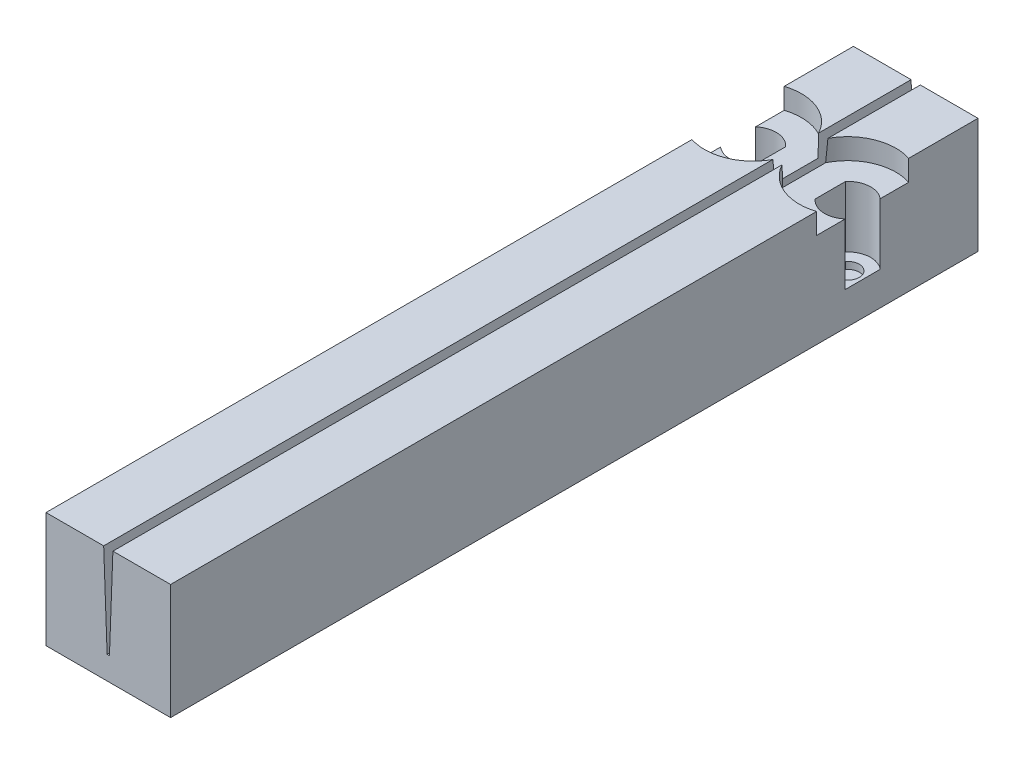
ISO-10303-21;
HEADER;
FILE_DESCRIPTION(('STEP AP214'),'2;1');
FILE_NAME('part.step','',(''),(''),'','','');
FILE_SCHEMA(('AUTOMOTIVE_DESIGN { 1 0 10303 214 1 1 1 1 }'));
ENDSEC;
DATA;
#1=APPLICATION_CONTEXT('core data for automotive mechanical design processes');
#2=APPLICATION_PROTOCOL_DEFINITION('international standard','automotive_design',2000,#1);
#3=PRODUCT_CONTEXT('',#1,'mechanical');
#4=PRODUCT('Part','Part','',(#3));
#5=PRODUCT_RELATED_PRODUCT_CATEGORY('part','',(#4));
#6=PRODUCT_DEFINITION_FORMATION('','',#4);
#7=PRODUCT_DEFINITION_CONTEXT('part definition',#1,'design');
#8=PRODUCT_DEFINITION('design','',#6,#7);
#9=PRODUCT_DEFINITION_SHAPE('','',#8);
#10=(LENGTH_UNIT() NAMED_UNIT(*) SI_UNIT(.MILLI.,.METRE.));
#11=(NAMED_UNIT(*) PLANE_ANGLE_UNIT() SI_UNIT($,.RADIAN.));
#12=(NAMED_UNIT(*) SI_UNIT($,.STERADIAN.) SOLID_ANGLE_UNIT());
#13=UNCERTAINTY_MEASURE_WITH_UNIT(LENGTH_MEASURE(1.E-05),#10,'distance_accuracy_value','');
#14=(GEOMETRIC_REPRESENTATION_CONTEXT(3) GLOBAL_UNCERTAINTY_ASSIGNED_CONTEXT((#13)) GLOBAL_UNIT_ASSIGNED_CONTEXT((#10,
#11,#12)) REPRESENTATION_CONTEXT('',''));
#15=CARTESIAN_POINT('',(0.,0.,0.));
#16=DIRECTION('',(0.,0.,1.));
#17=DIRECTION('',(1.,0.,0.));
#18=AXIS2_PLACEMENT_3D('',#15,#16,#17);
#19=CARTESIAN_POINT('',(-13.,14.5,-131.614378277661));
#20=DIRECTION('',(-1.,0.,0.));
#21=DIRECTION('',(0.,0.,1.));
#22=AXIS2_PLACEMENT_3D('',#19,#20,#21);
#23=PLANE('',#22);
#24=DIRECTION('',(0.,1.,0.));
#25=VECTOR('',#24,1.);
#26=CARTESIAN_POINT('',(-13.,14.5,-118.385621722339));
#27=LINE('',#26,#25);
#28=CARTESIAN_POINT('',(-13.,14.5,-118.385621722339));
#29=VERTEX_POINT('',#28);
#30=CARTESIAN_POINT('',(-13.,41.,-118.385621722339));
#31=VERTEX_POINT('',#30);
#32=EDGE_CURVE('E234',#29,#31,#27,.T.);
#33=ORIENTED_EDGE('',*,*,#32,.T.);
#34=DIRECTION('',(0.,0.,-1.));
#35=VECTOR('',#34,1.);
#36=CARTESIAN_POINT('',(-13.,41.,-131.614378277661));
#37=LINE('',#36,#35);
#38=CARTESIAN_POINT('',(-13.,41.,-131.614378277661));
#39=VERTEX_POINT('',#38);
#40=EDGE_CURVE('E58',#31,#39,#37,.T.);
#41=ORIENTED_EDGE('',*,*,#40,.T.);
#42=DIRECTION('',(0.,1.,0.));
#43=VECTOR('',#42,1.);
#44=CARTESIAN_POINT('',(-13.,14.5,-131.614378277661));
#45=LINE('',#44,#43);
#46=CARTESIAN_POINT('',(-13.,14.5,-131.614378277661));
#47=VERTEX_POINT('',#46);
#48=EDGE_CURVE('E241',#47,#39,#45,.T.);
#49=ORIENTED_EDGE('',*,*,#48,.F.);
#50=DIRECTION('',(0.,0.,1.));
#51=VECTOR('',#50,1.);
#52=CARTESIAN_POINT('',(-13.,14.5,-131.614378277661));
#53=LINE('',#52,#51);
#54=EDGE_CURVE('E240',#47,#29,#53,.T.);
#55=ORIENTED_EDGE('',*,*,#54,.T.);
#56=EDGE_LOOP('',(#33,#41,#49,#55));
#57=FACE_BOUND('',#56,.T.);
#58=ADVANCED_FACE('F35',(#57),#23,.T.);
#59=CARTESIAN_POINT('',(-20.5,14.5,-125.));
#60=DIRECTION('',(0.,-1.,0.));
#61=DIRECTION('',(0.,0.,-1.));
#62=AXIS2_PLACEMENT_3D('',#59,#60,#61);
#63=PLANE('',#62);
#64=CARTESIAN_POINT('',(-20.5,14.5,-125.));
#65=DIRECTION('',(0.,-1.,0.));
#66=DIRECTION('',(0.,0.,-1.));
#67=AXIS2_PLACEMENT_3D('',#64,#65,#66);
#68=CIRCLE('',#67,9.99999999999999);
#69=CARTESIAN_POINT('',(-27.,14.5,-117.400657923215));
#70=VERTEX_POINT('',#69);
#71=EDGE_CURVE('E245',#29,#70,#68,.T.);
#72=ORIENTED_EDGE('',*,*,#71,.F.);
#73=ORIENTED_EDGE('',*,*,#54,.F.);
#74=CARTESIAN_POINT('',(-27.,14.5,-132.599342076785));
#75=VERTEX_POINT('',#74);
#76=EDGE_CURVE('E430',#75,#47,#68,.T.);
#77=ORIENTED_EDGE('',*,*,#76,.F.);
#78=DIRECTION('',(0.,0.,-1.));
#79=VECTOR('',#78,1.);
#80=CARTESIAN_POINT('',(-27.,14.5,175.));
#81=LINE('',#80,#79);
#82=EDGE_CURVE('E11',#70,#75,#81,.T.);
#83=ORIENTED_EDGE('',*,*,#82,.F.);
#84=EDGE_LOOP('',(#72,#73,#77,#83));
#85=FACE_BOUND('',#84,.T.);
#86=CARTESIAN_POINT('',(-20.5,14.5,-125.));
#87=DIRECTION('',(0.,-1.,0.));
#88=DIRECTION('',(0.,0.,-1.));
#89=AXIS2_PLACEMENT_3D('',#86,#87,#88);
#90=CIRCLE('',#89,5.);
#91=CARTESIAN_POINT('',(-16.5,14.5,-122.));
#92=VERTEX_POINT('',#91);
#93=CARTESIAN_POINT('',(-16.5,14.5,-128.));
#94=VERTEX_POINT('',#93);
#95=EDGE_CURVE('E50',#92,#94,#90,.T.);
#96=ORIENTED_EDGE('',*,*,#95,.T.);
#97=DIRECTION('',(0.,0.,1.));
#98=VECTOR('',#97,1.);
#99=CARTESIAN_POINT('',(-16.5,14.5,-128.));
#100=LINE('',#99,#98);
#101=EDGE_CURVE('E441',#94,#92,#100,.T.);
#102=ORIENTED_EDGE('',*,*,#101,.T.);
#103=EDGE_LOOP('',(#96,#102));
#104=FACE_BOUND('',#103,.T.);
#105=ADVANCED_FACE('F432',(#85,#104),#63,.F.);
#106=CARTESIAN_POINT('',(-27.,50.,175.));
#107=DIRECTION('',(1.,0.,0.));
#108=DIRECTION('',(0.,0.,-1.));
#109=AXIS2_PLACEMENT_3D('',#106,#107,#108);
#110=PLANE('',#109);
#111=DIRECTION('',(0.,1.,0.));
#112=VECTOR('',#111,1.);
#113=CARTESIAN_POINT('',(-27.,14.5,-132.599342076785));
#114=LINE('',#113,#112);
#115=CARTESIAN_POINT('',(-27.,41.,-132.599342076785));
#116=VERTEX_POINT('',#115);
#117=EDGE_CURVE('E243',#116,#75,#114,.F.);
#118=ORIENTED_EDGE('',*,*,#117,.F.);
#119=DIRECTION('',(0.,0.,1.));
#120=VECTOR('',#119,1.);
#121=CARTESIAN_POINT('',(-27.,41.,175.));
#122=LINE('',#121,#120);
#123=CARTESIAN_POINT('',(-27.,41.,-144.968725547716));
#124=VERTEX_POINT('',#123);
#125=EDGE_CURVE('E264',#124,#116,#122,.T.);
#126=ORIENTED_EDGE('',*,*,#125,.F.);
#127=DIRECTION('',(0.,1.,0.));
#128=VECTOR('',#127,1.);
#129=CARTESIAN_POINT('',(-27.,41.,-144.968725547716));
#130=LINE('',#129,#128);
#131=CARTESIAN_POINT('',(-27.,50.,-144.968725547716));
#132=VERTEX_POINT('',#131);
#133=EDGE_CURVE('E260',#132,#124,#130,.F.);
#134=ORIENTED_EDGE('',*,*,#133,.F.);
#135=DIRECTION('',(0.,0.,1.));
#136=VECTOR('',#135,1.);
#137=CARTESIAN_POINT('',(-27.,50.,175.));
#138=LINE('',#137,#136);
#139=CARTESIAN_POINT('',(-27.,50.,-175.));
#140=VERTEX_POINT('',#139);
#141=EDGE_CURVE('E362',#140,#132,#138,.T.);
#142=ORIENTED_EDGE('',*,*,#141,.F.);
#143=DIRECTION('',(0.,-1.,0.));
#144=VECTOR('',#143,1.);
#145=CARTESIAN_POINT('',(-27.,50.,-175.));
#146=LINE('',#145,#144);
#147=CARTESIAN_POINT('',(-27.,0.,-175.));
#148=VERTEX_POINT('',#147);
#149=EDGE_CURVE('E383',#140,#148,#146,.T.);
#150=ORIENTED_EDGE('',*,*,#149,.T.);
#151=DIRECTION('',(0.,0.,1.));
#152=VECTOR('',#151,1.);
#153=CARTESIAN_POINT('',(-27.,0.,175.));
#154=LINE('',#153,#152);
#155=CARTESIAN_POINT('',(-27.,0.,175.));
#156=VERTEX_POINT('',#155);
#157=EDGE_CURVE('E374',#148,#156,#154,.T.);
#158=ORIENTED_EDGE('',*,*,#157,.T.);
#159=DIRECTION('',(0.,-1.,0.));
#160=VECTOR('',#159,1.);
#161=CARTESIAN_POINT('',(-27.,50.,175.));
#162=LINE('',#161,#160);
#163=CARTESIAN_POINT('',(-27.,50.,175.));
#164=VERTEX_POINT('',#163);
#165=EDGE_CURVE('E380',#164,#156,#162,.T.);
#166=ORIENTED_EDGE('',*,*,#165,.F.);
#167=CARTESIAN_POINT('',(-27.,50.,-105.031274452284));
#168=VERTEX_POINT('',#167);
#169=EDGE_CURVE('E361',#168,#164,#138,.T.);
#170=ORIENTED_EDGE('',*,*,#169,.F.);
#171=DIRECTION('',(0.,1.,0.));
#172=VECTOR('',#171,1.);
#173=CARTESIAN_POINT('',(-27.,41.,-105.031274452284));
#174=LINE('',#173,#172);
#175=CARTESIAN_POINT('',(-27.,41.,-105.031274452284));
#176=VERTEX_POINT('',#175);
#177=EDGE_CURVE('E258',#176,#168,#174,.T.);
#178=ORIENTED_EDGE('',*,*,#177,.F.);
#179=CARTESIAN_POINT('',(-27.,41.,-117.400657923215));
#180=VERTEX_POINT('',#179);
#181=EDGE_CURVE('E262',#180,#176,#122,.T.);
#182=ORIENTED_EDGE('',*,*,#181,.F.);
#183=DIRECTION('',(0.,1.,0.));
#184=VECTOR('',#183,1.);
#185=CARTESIAN_POINT('',(-27.,14.5,-117.400657923215));
#186=LINE('',#185,#184);
#187=EDGE_CURVE('E237',#70,#180,#186,.T.);
#188=ORIENTED_EDGE('',*,*,#187,.F.);
#189=ORIENTED_EDGE('',*,*,#82,.T.);
#190=EDGE_LOOP('',(#118,#126,#134,#142,#150,#158,#166,#170,#178,#182,#188,#189));
#191=FACE_BOUND('',#190,.T.);
#192=ADVANCED_FACE('F424',(#191),#110,.F.);
#193=CARTESIAN_POINT('',(0.,50.,0.));
#194=DIRECTION('',(0.,-1.,0.));
#195=DIRECTION('',(0.,0.,-1.));
#196=AXIS2_PLACEMENT_3D('',#193,#194,#195);
#197=PLANE('',#196);
#198=CARTESIAN_POINT('',(-20.5,50.,-125.));
#199=DIRECTION('',(0.,-1.,0.));
#200=DIRECTION('',(0.,0.,1.));
#201=AXIS2_PLACEMENT_3D('',#198,#199,#200);
#202=CIRCLE('',#201,21.);
#203=CARTESIAN_POINT('',(-2.,50.,-115.062696542824));
#204=VERTEX_POINT('',#203);
#205=EDGE_CURVE('E250',#204,#168,#202,.T.);
#206=ORIENTED_EDGE('',*,*,#205,.T.);
#207=ORIENTED_EDGE('',*,*,#169,.T.);
#208=DIRECTION('',(1.,0.,0.));
#209=VECTOR('',#208,1.);
#210=CARTESIAN_POINT('',(-27.,50.,175.));
#211=LINE('',#210,#209);
#212=CARTESIAN_POINT('',(-2.00000000000001,50.,175.));
#213=VERTEX_POINT('',#212);
#214=EDGE_CURVE('E366',#164,#213,#211,.T.);
#215=ORIENTED_EDGE('',*,*,#214,.T.);
#216=DIRECTION('',(0.,0.,1.));
#217=VECTOR('',#216,1.);
#218=CARTESIAN_POINT('',(-2.00000000000001,50.,-175.));
#219=LINE('',#218,#217);
#220=EDGE_CURVE('E347',#204,#213,#219,.T.);
#221=ORIENTED_EDGE('',*,*,#220,.F.);
#222=EDGE_LOOP('',(#206,#207,#215,#221));
#223=FACE_BOUND('',#222,.T.);
#224=ADVANCED_FACE('F460',(#223),#197,.F.);
#225=CARTESIAN_POINT('',(13.,14.5,-131.614378277661));
#226=DIRECTION('',(-1.,0.,0.));
#227=DIRECTION('',(0.,0.,1.));
#228=AXIS2_PLACEMENT_3D('',#225,#226,#227);
#229=PLANE('',#228);
#230=DIRECTION('',(0.,0.,-1.));
#231=VECTOR('',#230,1.);
#232=CARTESIAN_POINT('',(13.,41.,-131.614378277661));
#233=LINE('',#232,#231);
#234=CARTESIAN_POINT('',(13.,41.,-118.385621722339));
#235=VERTEX_POINT('',#234);
#236=CARTESIAN_POINT('',(13.,41.,-131.614378277661));
#237=VERTEX_POINT('',#236);
#238=EDGE_CURVE('E265',#235,#237,#233,.T.);
#239=ORIENTED_EDGE('',*,*,#238,.F.);
#240=DIRECTION('',(0.,1.,0.));
#241=VECTOR('',#240,1.);
#242=CARTESIAN_POINT('',(13.,14.5,-118.385621722339));
#243=LINE('',#242,#241);
#244=CARTESIAN_POINT('',(13.,14.5,-118.385621722339));
#245=VERTEX_POINT('',#244);
#246=EDGE_CURVE('E291',#245,#235,#243,.T.);
#247=ORIENTED_EDGE('',*,*,#246,.F.);
#248=DIRECTION('',(0.,0.,1.));
#249=VECTOR('',#248,1.);
#250=CARTESIAN_POINT('',(13.,14.5,-131.614378277661));
#251=LINE('',#250,#249);
#252=CARTESIAN_POINT('',(13.,14.5,-131.614378277661));
#253=VERTEX_POINT('',#252);
#254=EDGE_CURVE('E287',#253,#245,#251,.T.);
#255=ORIENTED_EDGE('',*,*,#254,.F.);
#256=DIRECTION('',(0.,1.,0.));
#257=VECTOR('',#256,1.);
#258=CARTESIAN_POINT('',(13.,14.5,-131.614378277661));
#259=LINE('',#258,#257);
#260=EDGE_CURVE('E290',#253,#237,#259,.T.);
#261=ORIENTED_EDGE('',*,*,#260,.T.);
#262=EDGE_LOOP('',(#239,#247,#255,#261));
#263=FACE_BOUND('',#262,.T.);
#264=ADVANCED_FACE('F491',(#263),#229,.F.);
#265=DIRECTION('',(0.,0.,-1.));
#266=VECTOR('',#265,1.);
#267=CARTESIAN_POINT('',(27.,50.,175.));
#268=LINE('',#267,#266);
#269=CARTESIAN_POINT('',(27.,50.,175.));
#270=VERTEX_POINT('',#269);
#271=CARTESIAN_POINT('',(27.,50.,-105.031274452284));
#272=VERTEX_POINT('',#271);
#273=EDGE_CURVE('E353',#270,#272,#268,.T.);
#274=ORIENTED_EDGE('',*,*,#273,.T.);
#275=CARTESIAN_POINT('',(20.5,50.,-125.));
#276=DIRECTION('',(0.,1.,0.));
#277=DIRECTION('',(0.,0.,1.));
#278=AXIS2_PLACEMENT_3D('',#275,#276,#277);
#279=CIRCLE('',#278,21.);
#280=CARTESIAN_POINT('',(1.99999999999999,50.,-115.062696542824));
#281=VERTEX_POINT('',#280);
#282=EDGE_CURVE('E306',#281,#272,#279,.T.);
#283=ORIENTED_EDGE('',*,*,#282,.F.);
#284=DIRECTION('',(0.,0.,1.));
#285=VECTOR('',#284,1.);
#286=CARTESIAN_POINT('',(1.99999999999999,50.,-175.));
#287=LINE('',#286,#285);
#288=CARTESIAN_POINT('',(1.99999999999999,50.,175.));
#289=VERTEX_POINT('',#288);
#290=EDGE_CURVE('E351',#281,#289,#287,.T.);
#291=ORIENTED_EDGE('',*,*,#290,.T.);
#292=EDGE_CURVE('E365',#289,#270,#211,.T.);
#293=ORIENTED_EDGE('',*,*,#292,.T.);
#294=EDGE_LOOP('',(#274,#283,#291,#293));
#295=FACE_BOUND('',#294,.T.);
#296=ADVANCED_FACE('F494',(#295),#197,.F.);
#297=CARTESIAN_POINT('',(-2.,50.,-134.937303457176));
#298=VERTEX_POINT('',#297);
#299=EDGE_CURVE('E255',#132,#298,#202,.T.);
#300=ORIENTED_EDGE('',*,*,#299,.T.);
#301=CARTESIAN_POINT('',(-2.00000000000001,50.,-175.));
#302=VERTEX_POINT('',#301);
#303=EDGE_CURVE('E344',#302,#298,#219,.T.);
#304=ORIENTED_EDGE('',*,*,#303,.F.);
#305=DIRECTION('',(-1.,0.,0.));
#306=VECTOR('',#305,1.);
#307=CARTESIAN_POINT('',(-27.,50.,-175.));
#308=LINE('',#307,#306);
#309=EDGE_CURVE('E356',#302,#140,#308,.T.);
#310=ORIENTED_EDGE('',*,*,#309,.T.);
#311=ORIENTED_EDGE('',*,*,#141,.T.);
#312=EDGE_LOOP('',(#300,#304,#310,#311));
#313=FACE_BOUND('',#312,.T.);
#314=ADVANCED_FACE('F418',(#313),#197,.F.);
#315=CARTESIAN_POINT('',(27.,50.,175.));
#316=DIRECTION('',(-1.,0.,0.));
#317=DIRECTION('',(0.,0.,1.));
#318=AXIS2_PLACEMENT_3D('',#315,#316,#317);
#319=PLANE('',#318);
#320=DIRECTION('',(0.,0.,1.));
#321=VECTOR('',#320,1.);
#322=CARTESIAN_POINT('',(27.,14.5,175.));
#323=LINE('',#322,#321);
#324=CARTESIAN_POINT('',(27.,14.5,-132.599342076785));
#325=VERTEX_POINT('',#324);
#326=CARTESIAN_POINT('',(27.,14.5,-117.400657923215));
#327=VERTEX_POINT('',#326);
#328=EDGE_CURVE('E395',#325,#327,#323,.T.);
#329=ORIENTED_EDGE('',*,*,#328,.T.);
#330=DIRECTION('',(0.,1.,0.));
#331=VECTOR('',#330,1.);
#332=CARTESIAN_POINT('',(27.,14.5,-117.400657923215));
#333=LINE('',#332,#331);
#334=CARTESIAN_POINT('',(27.,41.,-117.400657923215));
#335=VERTEX_POINT('',#334);
#336=EDGE_CURVE('E299',#327,#335,#333,.T.);
#337=ORIENTED_EDGE('',*,*,#336,.T.);
#338=DIRECTION('',(0.,0.,-1.));
#339=VECTOR('',#338,1.);
#340=CARTESIAN_POINT('',(27.,41.,175.));
#341=LINE('',#340,#339);
#342=CARTESIAN_POINT('',(27.,41.,-105.031274452284));
#343=VERTEX_POINT('',#342);
#344=EDGE_CURVE('E315',#343,#335,#341,.T.);
#345=ORIENTED_EDGE('',*,*,#344,.F.);
#346=DIRECTION('',(0.,1.,0.));
#347=VECTOR('',#346,1.);
#348=CARTESIAN_POINT('',(27.,41.,-105.031274452284));
#349=LINE('',#348,#347);
#350=EDGE_CURVE('E319',#343,#272,#349,.T.);
#351=ORIENTED_EDGE('',*,*,#350,.T.);
#352=ORIENTED_EDGE('',*,*,#273,.F.);
#353=DIRECTION('',(0.,-1.,0.));
#354=VECTOR('',#353,1.);
#355=CARTESIAN_POINT('',(27.,50.,175.));
#356=LINE('',#355,#354);
#357=CARTESIAN_POINT('',(27.,0.,175.));
#358=VERTEX_POINT('',#357);
#359=EDGE_CURVE('E369',#270,#358,#356,.T.);
#360=ORIENTED_EDGE('',*,*,#359,.T.);
#361=DIRECTION('',(0.,0.,-1.));
#362=VECTOR('',#361,1.);
#363=CARTESIAN_POINT('',(27.,0.,175.));
#364=LINE('',#363,#362);
#365=CARTESIAN_POINT('',(27.,0.,-175.));
#366=VERTEX_POINT('',#365);
#367=EDGE_CURVE('E343',#358,#366,#364,.T.);
#368=ORIENTED_EDGE('',*,*,#367,.T.);
#369=DIRECTION('',(0.,-1.,0.));
#370=VECTOR('',#369,1.);
#371=CARTESIAN_POINT('',(27.,50.,-175.));
#372=LINE('',#371,#370);
#373=CARTESIAN_POINT('',(27.,50.,-175.));
#374=VERTEX_POINT('',#373);
#375=EDGE_CURVE('E386',#374,#366,#372,.T.);
#376=ORIENTED_EDGE('',*,*,#375,.F.);
#377=CARTESIAN_POINT('',(27.,50.,-144.968725547716));
#378=VERTEX_POINT('',#377);
#379=EDGE_CURVE('E357',#378,#374,#268,.T.);
#380=ORIENTED_EDGE('',*,*,#379,.F.);
#381=DIRECTION('',(0.,1.,0.));
#382=VECTOR('',#381,1.);
#383=CARTESIAN_POINT('',(27.,41.,-144.968725547716));
#384=LINE('',#383,#382);
#385=CARTESIAN_POINT('',(27.,41.,-144.968725547716));
#386=VERTEX_POINT('',#385);
#387=EDGE_CURVE('E316',#378,#386,#384,.F.);
#388=ORIENTED_EDGE('',*,*,#387,.T.);
#389=CARTESIAN_POINT('',(27.,41.,-132.599342076785));
#390=VERTEX_POINT('',#389);
#391=EDGE_CURVE('E313',#390,#386,#341,.T.);
#392=ORIENTED_EDGE('',*,*,#391,.F.);
#393=DIRECTION('',(0.,1.,0.));
#394=VECTOR('',#393,1.);
#395=CARTESIAN_POINT('',(27.,14.5,-132.599342076785));
#396=LINE('',#395,#394);
#397=EDGE_CURVE('E294',#390,#325,#396,.F.);
#398=ORIENTED_EDGE('',*,*,#397,.T.);
#399=EDGE_LOOP('',(#329,#337,#345,#351,#352,#360,#368,#376,#380,#388,#392,#398));
#400=FACE_BOUND('',#399,.T.);
#401=ADVANCED_FACE('F37',(#400),#319,.F.);
#402=CARTESIAN_POINT('',(-27.,50.,-175.));
#403=DIRECTION('',(0.,0.,1.));
#404=DIRECTION('',(1.,0.,0.));
#405=AXIS2_PLACEMENT_3D('',#402,#403,#404);
#406=PLANE('',#405);
#407=ORIENTED_EDGE('',*,*,#309,.F.);
#408=DIRECTION('',(0.0374736605890943,-0.999297615709181,0.));
#409=VECTOR('',#408,1.);
#410=CARTESIAN_POINT('',(-0.500000000000004,10.,-175.));
#411=LINE('',#410,#409);
#412=CARTESIAN_POINT('',(-0.500000000000004,10.,-175.));
#413=VERTEX_POINT('',#412);
#414=EDGE_CURVE('E330',#302,#413,#411,.T.);
#415=ORIENTED_EDGE('',*,*,#414,.T.);
#416=DIRECTION('',(1.,0.,0.));
#417=VECTOR('',#416,1.);
#418=CARTESIAN_POINT('',(-0.500000000000004,10.,-175.));
#419=LINE('',#418,#417);
#420=CARTESIAN_POINT('',(0.499999999999997,10.,-175.));
#421=VERTEX_POINT('',#420);
#422=EDGE_CURVE('E323',#413,#421,#419,.T.);
#423=ORIENTED_EDGE('',*,*,#422,.T.);
#424=DIRECTION('',(0.0374736605890942,0.999297615709181,0.));
#425=VECTOR('',#424,1.);
#426=CARTESIAN_POINT('',(1.99999999999999,50.,-175.));
#427=LINE('',#426,#425);
#428=CARTESIAN_POINT('',(1.99999999999999,50.,-175.));
#429=VERTEX_POINT('',#428);
#430=EDGE_CURVE('E326',#421,#429,#427,.T.);
#431=ORIENTED_EDGE('',*,*,#430,.T.);
#432=EDGE_CURVE('E358',#374,#429,#308,.T.);
#433=ORIENTED_EDGE('',*,*,#432,.F.);
#434=ORIENTED_EDGE('',*,*,#375,.T.);
#435=DIRECTION('',(-1.,0.,0.));
#436=VECTOR('',#435,1.);
#437=CARTESIAN_POINT('',(-27.,0.,-175.));
#438=LINE('',#437,#436);
#439=EDGE_CURVE('E372',#366,#148,#438,.T.);
#440=ORIENTED_EDGE('',*,*,#439,.T.);
#441=ORIENTED_EDGE('',*,*,#149,.F.);
#442=EDGE_LOOP('',(#407,#415,#423,#431,#433,#434,#440,#441));
#443=FACE_BOUND('',#442,.T.);
#444=ADVANCED_FACE('F527',(#443),#406,.F.);
#445=CARTESIAN_POINT('',(-27.,50.,175.));
#446=DIRECTION('',(0.,0.,-1.));
#447=DIRECTION('',(-1.,0.,0.));
#448=AXIS2_PLACEMENT_3D('',#445,#446,#447);
#449=PLANE('',#448);
#450=DIRECTION('',(1.,0.,0.));
#451=VECTOR('',#450,1.);
#452=CARTESIAN_POINT('',(-0.500000000000004,10.,175.));
#453=LINE('',#452,#451);
#454=CARTESIAN_POINT('',(-0.500000000000004,10.,175.));
#455=VERTEX_POINT('',#454);
#456=CARTESIAN_POINT('',(0.499999999999997,10.,175.));
#457=VERTEX_POINT('',#456);
#458=EDGE_CURVE('E322',#455,#457,#453,.T.);
#459=ORIENTED_EDGE('',*,*,#458,.F.);
#460=DIRECTION('',(0.0374736605890943,-0.999297615709181,0.));
#461=VECTOR('',#460,1.);
#462=CARTESIAN_POINT('',(-0.500000000000004,10.,175.));
#463=LINE('',#462,#461);
#464=EDGE_CURVE('E327',#213,#455,#463,.T.);
#465=ORIENTED_EDGE('',*,*,#464,.F.);
#466=ORIENTED_EDGE('',*,*,#214,.F.);
#467=ORIENTED_EDGE('',*,*,#165,.T.);
#468=DIRECTION('',(1.,0.,0.));
#469=VECTOR('',#468,1.);
#470=CARTESIAN_POINT('',(-27.,0.,175.));
#471=LINE('',#470,#469);
#472=EDGE_CURVE('E376',#156,#358,#471,.T.);
#473=ORIENTED_EDGE('',*,*,#472,.T.);
#474=ORIENTED_EDGE('',*,*,#359,.F.);
#475=ORIENTED_EDGE('',*,*,#292,.F.);
#476=DIRECTION('',(0.0374736605890942,0.999297615709181,0.));
#477=VECTOR('',#476,1.);
#478=CARTESIAN_POINT('',(1.99999999999999,50.,175.));
#479=LINE('',#478,#477);
#480=EDGE_CURVE('E336',#457,#289,#479,.T.);
#481=ORIENTED_EDGE('',*,*,#480,.F.);
#482=EDGE_LOOP('',(#459,#465,#466,#467,#473,#474,#475,#481));
#483=FACE_BOUND('',#482,.T.);
#484=ADVANCED_FACE('F521',(#483),#449,.F.);
#485=CARTESIAN_POINT('',(1.99999999999999,50.,-134.937303457176));
#486=VERTEX_POINT('',#485);
#487=EDGE_CURVE('E348',#429,#486,#287,.T.);
#488=ORIENTED_EDGE('',*,*,#487,.T.);
#489=EDGE_CURVE('E311',#378,#486,#279,.T.);
#490=ORIENTED_EDGE('',*,*,#489,.F.);
#491=ORIENTED_EDGE('',*,*,#379,.T.);
#492=ORIENTED_EDGE('',*,*,#432,.T.);
#493=EDGE_LOOP('',(#488,#490,#491,#492));
#494=FACE_BOUND('',#493,.T.);
#495=ADVANCED_FACE('F518',(#494),#197,.F.);
#496=CARTESIAN_POINT('',(0.,0.,0.));
#497=DIRECTION('',(0.,-1.,0.));
#498=DIRECTION('',(0.,0.,-1.));
#499=AXIS2_PLACEMENT_3D('',#496,#497,#498);
#500=PLANE('',#499);
#501=ORIENTED_EDGE('',*,*,#367,.F.);
#502=ORIENTED_EDGE('',*,*,#472,.F.);
#503=ORIENTED_EDGE('',*,*,#157,.F.);
#504=ORIENTED_EDGE('',*,*,#439,.F.);
#505=EDGE_LOOP('',(#501,#502,#503,#504));
#506=FACE_BOUND('',#505,.T.);
#507=ADVANCED_FACE('F516',(#506),#500,.T.);
#508=CARTESIAN_POINT('',(-0.500000000000004,10.,-175.));
#509=DIRECTION('',(0.,-1.,0.));
#510=DIRECTION('',(0.,0.,-1.));
#511=AXIS2_PLACEMENT_3D('',#508,#509,#510);
#512=PLANE('',#511);
#513=ORIENTED_EDGE('',*,*,#458,.T.);
#514=DIRECTION('',(0.,0.,1.));
#515=VECTOR('',#514,1.);
#516=CARTESIAN_POINT('',(0.499999999999997,10.,-175.));
#517=LINE('',#516,#515);
#518=EDGE_CURVE('E333',#421,#457,#517,.T.);
#519=ORIENTED_EDGE('',*,*,#518,.F.);
#520=ORIENTED_EDGE('',*,*,#422,.F.);
#521=DIRECTION('',(0.,0.,1.));
#522=VECTOR('',#521,1.);
#523=CARTESIAN_POINT('',(-0.500000000000004,10.,-175.));
#524=LINE('',#523,#522);
#525=EDGE_CURVE('E341',#413,#455,#524,.T.);
#526=ORIENTED_EDGE('',*,*,#525,.T.);
#527=EDGE_LOOP('',(#513,#519,#520,#526));
#528=FACE_BOUND('',#527,.T.);
#529=ADVANCED_FACE('F510',(#528),#512,.F.);
#530=CARTESIAN_POINT('',(-0.500000000000004,10.,-175.));
#531=DIRECTION('',(-0.999297615709181,-0.0374736605890943,0.));
#532=DIRECTION('',(0.0374736605890943,-0.999297615709181,0.));
#533=AXIS2_PLACEMENT_3D('',#530,#531,#532);
#534=PLANE('',#533);
#535=CARTESIAN_POINT('',(-20.5,543.333333333333,-125.));
#536=DIRECTION('',(-0.999297615709181,-0.0374736605890943,0.));
#537=DIRECTION('',(-0.0374736605890943,0.999297615709181,0.));
#538=AXIS2_PLACEMENT_3D('',#535,#536,#537);
#539=ELLIPSE('',#538,560.393611669512,21.);
#540=CARTESIAN_POINT('',(-1.6625,41.,-115.718373324142));
#541=VERTEX_POINT('',#540);
#542=EDGE_CURVE('E43',#204,#541,#539,.F.);
#543=ORIENTED_EDGE('',*,*,#542,.F.);
#544=ORIENTED_EDGE('',*,*,#220,.T.);
#545=ORIENTED_EDGE('',*,*,#464,.T.);
#546=ORIENTED_EDGE('',*,*,#525,.F.);
#547=ORIENTED_EDGE('',*,*,#414,.F.);
#548=ORIENTED_EDGE('',*,*,#303,.T.);
#549=CARTESIAN_POINT('',(-1.6625,41.,-134.281626675858));
#550=VERTEX_POINT('',#549);
#551=EDGE_CURVE('E398',#550,#298,#539,.F.);
#552=ORIENTED_EDGE('',*,*,#551,.F.);
#553=DIRECTION('',(0.,0.,-1.));
#554=VECTOR('',#553,1.);
#555=CARTESIAN_POINT('',(-1.6625,41.,-175.));
#556=LINE('',#555,#554);
#557=EDGE_CURVE('E399',#541,#550,#556,.T.);
#558=ORIENTED_EDGE('',*,*,#557,.F.);
#559=EDGE_LOOP('',(#543,#544,#545,#546,#547,#548,#552,#558));
#560=FACE_BOUND('',#559,.T.);
#561=ADVANCED_FACE('F411',(#560),#534,.F.);
#562=CARTESIAN_POINT('',(1.99999999999999,50.,-175.));
#563=DIRECTION('',(0.999297615709181,-0.0374736605890942,0.));
#564=DIRECTION('',(0.0374736605890942,0.999297615709181,0.));
#565=AXIS2_PLACEMENT_3D('',#562,#563,#564);
#566=PLANE('',#565);
#567=ORIENTED_EDGE('',*,*,#290,.F.);
#568=CARTESIAN_POINT('',(20.5,543.333333333334,-125.));
#569=DIRECTION('',(0.999297615709181,-0.0374736605890942,0.));
#570=DIRECTION('',(0.0374736605890942,0.999297615709181,0.));
#571=AXIS2_PLACEMENT_3D('',#568,#569,#570);
#572=ELLIPSE('',#571,560.393611669513,21.);
#573=CARTESIAN_POINT('',(1.66249999999999,41.,-115.718373324142));
#574=VERTEX_POINT('',#573);
#575=EDGE_CURVE('E394',#281,#574,#572,.T.);
#576=ORIENTED_EDGE('',*,*,#575,.T.);
#577=DIRECTION('',(0.,0.,1.));
#578=VECTOR('',#577,1.);
#579=CARTESIAN_POINT('',(1.6625,41.,-175.));
#580=LINE('',#579,#578);
#581=CARTESIAN_POINT('',(1.66249999999999,41.,-134.281626675858));
#582=VERTEX_POINT('',#581);
#583=EDGE_CURVE('E389',#582,#574,#580,.T.);
#584=ORIENTED_EDGE('',*,*,#583,.F.);
#585=EDGE_CURVE('E391',#582,#486,#572,.T.);
#586=ORIENTED_EDGE('',*,*,#585,.T.);
#587=ORIENTED_EDGE('',*,*,#487,.F.);
#588=ORIENTED_EDGE('',*,*,#430,.F.);
#589=ORIENTED_EDGE('',*,*,#518,.T.);
#590=ORIENTED_EDGE('',*,*,#480,.T.);
#591=EDGE_LOOP('',(#567,#576,#584,#586,#587,#588,#589,#590));
#592=FACE_BOUND('',#591,.T.);
#593=ADVANCED_FACE('F506',(#592),#566,.F.);
#594=CARTESIAN_POINT('',(20.5,41.,-125.));
#595=DIRECTION('',(0.,1.,0.));
#596=DIRECTION('',(0.,0.,1.));
#597=AXIS2_PLACEMENT_3D('',#594,#595,#596);
#598=CYLINDRICAL_SURFACE('',#597,21.);
#599=CARTESIAN_POINT('',(20.5,41.,-125.));
#600=DIRECTION('',(0.,1.,0.));
#601=DIRECTION('',(0.,0.,1.));
#602=AXIS2_PLACEMENT_3D('',#599,#600,#601);
#603=CIRCLE('',#602,21.);
#604=EDGE_CURVE('E307',#574,#343,#603,.T.);
#605=ORIENTED_EDGE('',*,*,#604,.F.);
#606=ORIENTED_EDGE('',*,*,#575,.F.);
#607=ORIENTED_EDGE('',*,*,#282,.T.);
#608=ORIENTED_EDGE('',*,*,#350,.F.);
#609=EDGE_LOOP('',(#605,#606,#607,#608));
#610=FACE_BOUND('',#609,.T.);
#611=ADVANCED_FACE('F503',(#610),#598,.F.);
#612=ORIENTED_EDGE('',*,*,#489,.T.);
#613=ORIENTED_EDGE('',*,*,#585,.F.);
#614=EDGE_CURVE('E310',#386,#582,#603,.T.);
#615=ORIENTED_EDGE('',*,*,#614,.F.);
#616=ORIENTED_EDGE('',*,*,#387,.F.);
#617=EDGE_LOOP('',(#612,#613,#615,#616));
#618=FACE_BOUND('',#617,.T.);
#619=ADVANCED_FACE('F501',(#618),#598,.F.);
#620=CARTESIAN_POINT('',(20.5,41.,-125.));
#621=DIRECTION('',(0.,1.,0.));
#622=DIRECTION('',(0.,0.,1.));
#623=AXIS2_PLACEMENT_3D('',#620,#621,#622);
#624=PLANE('',#623);
#625=ORIENTED_EDGE('',*,*,#344,.T.);
#626=CARTESIAN_POINT('',(20.5,41.,-125.));
#627=DIRECTION('',(0.,1.,0.));
#628=DIRECTION('',(0.,0.,1.));
#629=AXIS2_PLACEMENT_3D('',#626,#627,#628);
#630=CIRCLE('',#629,9.99999999999999);
#631=EDGE_CURVE('E302',#235,#335,#630,.T.);
#632=ORIENTED_EDGE('',*,*,#631,.F.);
#633=ORIENTED_EDGE('',*,*,#238,.T.);
#634=EDGE_CURVE('E303',#390,#237,#630,.T.);
#635=ORIENTED_EDGE('',*,*,#634,.F.);
#636=ORIENTED_EDGE('',*,*,#391,.T.);
#637=ORIENTED_EDGE('',*,*,#614,.T.);
#638=ORIENTED_EDGE('',*,*,#583,.T.);
#639=ORIENTED_EDGE('',*,*,#604,.T.);
#640=EDGE_LOOP('',(#625,#632,#633,#635,#636,#637,#638,#639));
#641=FACE_BOUND('',#640,.T.);
#642=ADVANCED_FACE('F489',(#641),#624,.T.);
#643=CARTESIAN_POINT('',(20.5,14.5,-125.));
#644=DIRECTION('',(0.,-1.,0.));
#645=DIRECTION('',(0.,0.,-1.));
#646=AXIS2_PLACEMENT_3D('',#643,#644,#645);
#647=PLANE('',#646);
#648=DIRECTION('',(0.,0.,1.));
#649=VECTOR('',#648,1.);
#650=CARTESIAN_POINT('',(16.5,14.5,-128.));
#651=LINE('',#650,#649);
#652=CARTESIAN_POINT('',(16.5,14.5,-128.));
#653=VERTEX_POINT('',#652);
#654=CARTESIAN_POINT('',(16.5,14.5,-122.));
#655=VERTEX_POINT('',#654);
#656=EDGE_CURVE('E272',#653,#655,#651,.T.);
#657=ORIENTED_EDGE('',*,*,#656,.F.);
#658=CARTESIAN_POINT('',(20.5,14.5,-125.));
#659=DIRECTION('',(0.,1.,0.));
#660=DIRECTION('',(0.,0.,-1.));
#661=AXIS2_PLACEMENT_3D('',#658,#659,#660);
#662=CIRCLE('',#661,5.);
#663=EDGE_CURVE('E267',#655,#653,#662,.T.);
#664=ORIENTED_EDGE('',*,*,#663,.F.);
#665=EDGE_LOOP('',(#657,#664));
#666=FACE_BOUND('',#665,.T.);
#667=CARTESIAN_POINT('',(20.5,14.5,-125.));
#668=DIRECTION('',(0.,1.,0.));
#669=DIRECTION('',(0.,0.,-1.));
#670=AXIS2_PLACEMENT_3D('',#667,#668,#669);
#671=CIRCLE('',#670,9.99999999999999);
#672=EDGE_CURVE('E281',#325,#253,#671,.T.);
#673=ORIENTED_EDGE('',*,*,#672,.T.);
#674=ORIENTED_EDGE('',*,*,#254,.T.);
#675=EDGE_CURVE('E284',#245,#327,#671,.T.);
#676=ORIENTED_EDGE('',*,*,#675,.T.);
#677=ORIENTED_EDGE('',*,*,#328,.F.);
#678=EDGE_LOOP('',(#673,#674,#676,#677));
#679=FACE_BOUND('',#678,.T.);
#680=ADVANCED_FACE('F485',(#666,#679),#647,.F.);
#681=CARTESIAN_POINT('',(20.5,14.5,-125.));
#682=DIRECTION('',(0.,1.,0.));
#683=DIRECTION('',(0.,0.,1.));
#684=AXIS2_PLACEMENT_3D('',#681,#682,#683);
#685=CYLINDRICAL_SURFACE('',#684,9.99999999999999);
#686=ORIENTED_EDGE('',*,*,#675,.F.);
#687=ORIENTED_EDGE('',*,*,#246,.T.);
#688=ORIENTED_EDGE('',*,*,#631,.T.);
#689=ORIENTED_EDGE('',*,*,#336,.F.);
#690=EDGE_LOOP('',(#686,#687,#688,#689));
#691=FACE_BOUND('',#690,.T.);
#692=ADVANCED_FACE('F488',(#691),#685,.F.);
#693=ORIENTED_EDGE('',*,*,#634,.T.);
#694=ORIENTED_EDGE('',*,*,#260,.F.);
#695=ORIENTED_EDGE('',*,*,#672,.F.);
#696=ORIENTED_EDGE('',*,*,#397,.F.);
#697=EDGE_LOOP('',(#693,#694,#695,#696));
#698=FACE_BOUND('',#697,.T.);
#699=ADVANCED_FACE('F483',(#698),#685,.F.);
#700=CARTESIAN_POINT('',(20.5,11.5,-125.));
#701=DIRECTION('',(0.,1.,0.));
#702=DIRECTION('',(0.,0.,1.));
#703=AXIS2_PLACEMENT_3D('',#700,#701,#702);
#704=CYLINDRICAL_SURFACE('',#703,5.);
#705=ORIENTED_EDGE('',*,*,#663,.T.);
#706=DIRECTION('',(0.,1.,0.));
#707=VECTOR('',#706,1.);
#708=CARTESIAN_POINT('',(16.5,11.5,-128.));
#709=LINE('',#708,#707);
#710=CARTESIAN_POINT('',(16.5,11.5,-128.));
#711=VERTEX_POINT('',#710);
#712=EDGE_CURVE('E275',#711,#653,#709,.T.);
#713=ORIENTED_EDGE('',*,*,#712,.F.);
#714=CARTESIAN_POINT('',(20.5,11.5,-125.));
#715=DIRECTION('',(0.,1.,0.));
#716=DIRECTION('',(0.,0.,-1.));
#717=AXIS2_PLACEMENT_3D('',#714,#715,#716);
#718=CIRCLE('',#717,5.);
#719=CARTESIAN_POINT('',(16.5,11.5,-122.));
#720=VERTEX_POINT('',#719);
#721=EDGE_CURVE('E268',#720,#711,#718,.T.);
#722=ORIENTED_EDGE('',*,*,#721,.F.);
#723=DIRECTION('',(0.,1.,0.));
#724=VECTOR('',#723,1.);
#725=CARTESIAN_POINT('',(16.5,11.5,-122.));
#726=LINE('',#725,#724);
#727=EDGE_CURVE('E279',#720,#655,#726,.T.);
#728=ORIENTED_EDGE('',*,*,#727,.T.);
#729=EDGE_LOOP('',(#705,#713,#722,#728));
#730=FACE_BOUND('',#729,.T.);
#731=ADVANCED_FACE('F479',(#730),#704,.F.);
#732=CARTESIAN_POINT('',(16.5,11.5,-128.));
#733=DIRECTION('',(-1.,0.,0.));
#734=DIRECTION('',(0.,0.,1.));
#735=AXIS2_PLACEMENT_3D('',#732,#733,#734);
#736=PLANE('',#735);
#737=ORIENTED_EDGE('',*,*,#656,.T.);
#738=ORIENTED_EDGE('',*,*,#727,.F.);
#739=DIRECTION('',(0.,0.,1.));
#740=VECTOR('',#739,1.);
#741=CARTESIAN_POINT('',(16.5,11.5,-128.));
#742=LINE('',#741,#740);
#743=EDGE_CURVE('E271',#711,#720,#742,.T.);
#744=ORIENTED_EDGE('',*,*,#743,.F.);
#745=ORIENTED_EDGE('',*,*,#712,.T.);
#746=EDGE_LOOP('',(#737,#738,#744,#745));
#747=FACE_BOUND('',#746,.T.);
#748=ADVANCED_FACE('F475',(#747),#736,.F.);
#749=CARTESIAN_POINT('',(20.5,11.5,-125.));
#750=DIRECTION('',(0.,-1.,0.));
#751=DIRECTION('',(0.,0.,-1.));
#752=AXIS2_PLACEMENT_3D('',#749,#750,#751);
#753=PLANE('',#752);
#754=ORIENTED_EDGE('',*,*,#721,.T.);
#755=ORIENTED_EDGE('',*,*,#743,.T.);
#756=EDGE_LOOP('',(#754,#755));
#757=FACE_BOUND('',#756,.T.);
#758=ADVANCED_FACE('F470',(#757),#753,.F.);
#759=CARTESIAN_POINT('',(-20.5,41.,-125.));
#760=DIRECTION('',(0.,1.,0.));
#761=DIRECTION('',(0.,0.,1.));
#762=AXIS2_PLACEMENT_3D('',#759,#760,#761);
#763=PLANE('',#762);
#764=ORIENTED_EDGE('',*,*,#125,.T.);
#765=CARTESIAN_POINT('',(-20.5,41.,-125.));
#766=DIRECTION('',(0.,-1.,0.));
#767=DIRECTION('',(0.,0.,1.));
#768=AXIS2_PLACEMENT_3D('',#765,#766,#767);
#769=CIRCLE('',#768,9.99999999999999);
#770=EDGE_CURVE('E228',#116,#39,#769,.T.);
#771=ORIENTED_EDGE('',*,*,#770,.T.);
#772=ORIENTED_EDGE('',*,*,#40,.F.);
#773=EDGE_CURVE('E226',#31,#180,#769,.T.);
#774=ORIENTED_EDGE('',*,*,#773,.T.);
#775=ORIENTED_EDGE('',*,*,#181,.T.);
#776=CARTESIAN_POINT('',(-20.5,41.,-125.));
#777=DIRECTION('',(0.,-1.,0.));
#778=DIRECTION('',(0.,0.,1.));
#779=AXIS2_PLACEMENT_3D('',#776,#777,#778);
#780=CIRCLE('',#779,21.);
#781=EDGE_CURVE('E251',#541,#176,#780,.T.);
#782=ORIENTED_EDGE('',*,*,#781,.F.);
#783=ORIENTED_EDGE('',*,*,#557,.T.);
#784=EDGE_CURVE('E254',#124,#550,#780,.T.);
#785=ORIENTED_EDGE('',*,*,#784,.F.);
#786=EDGE_LOOP('',(#764,#771,#772,#774,#775,#782,#783,#785));
#787=FACE_BOUND('',#786,.T.);
#788=ADVANCED_FACE('F225',(#787),#763,.T.);
#789=CARTESIAN_POINT('',(-20.5,41.,-125.));
#790=DIRECTION('',(0.,1.,0.));
#791=DIRECTION('',(0.,0.,1.));
#792=AXIS2_PLACEMENT_3D('',#789,#790,#791);
#793=CYLINDRICAL_SURFACE('',#792,21.);
#794=ORIENTED_EDGE('',*,*,#133,.T.);
#795=ORIENTED_EDGE('',*,*,#784,.T.);
#796=ORIENTED_EDGE('',*,*,#551,.T.);
#797=ORIENTED_EDGE('',*,*,#299,.F.);
#798=EDGE_LOOP('',(#794,#795,#796,#797));
#799=FACE_BOUND('',#798,.T.);
#800=ADVANCED_FACE('F415',(#799),#793,.F.);
#801=ORIENTED_EDGE('',*,*,#177,.T.);
#802=ORIENTED_EDGE('',*,*,#205,.F.);
#803=ORIENTED_EDGE('',*,*,#542,.T.);
#804=ORIENTED_EDGE('',*,*,#781,.T.);
#805=EDGE_LOOP('',(#801,#802,#803,#804));
#806=FACE_BOUND('',#805,.T.);
#807=ADVANCED_FACE('F407',(#806),#793,.F.);
#808=CARTESIAN_POINT('',(-20.5,14.5,-125.));
#809=DIRECTION('',(0.,1.,0.));
#810=DIRECTION('',(0.,0.,1.));
#811=AXIS2_PLACEMENT_3D('',#808,#809,#810);
#812=CYLINDRICAL_SURFACE('',#811,9.99999999999999);
#813=ORIENTED_EDGE('',*,*,#187,.T.);
#814=ORIENTED_EDGE('',*,*,#773,.F.);
#815=ORIENTED_EDGE('',*,*,#32,.F.);
#816=ORIENTED_EDGE('',*,*,#71,.T.);
#817=EDGE_LOOP('',(#813,#814,#815,#816));
#818=FACE_BOUND('',#817,.T.);
#819=ADVANCED_FACE('F232',(#818),#812,.F.);
#820=ORIENTED_EDGE('',*,*,#117,.T.);
#821=ORIENTED_EDGE('',*,*,#76,.T.);
#822=ORIENTED_EDGE('',*,*,#48,.T.);
#823=ORIENTED_EDGE('',*,*,#770,.F.);
#824=EDGE_LOOP('',(#820,#821,#822,#823));
#825=FACE_BOUND('',#824,.T.);
#826=ADVANCED_FACE('F429',(#825),#812,.F.);
#827=CARTESIAN_POINT('',(-20.5,11.5,-125.));
#828=DIRECTION('',(0.,1.,0.));
#829=DIRECTION('',(0.,0.,1.));
#830=AXIS2_PLACEMENT_3D('',#827,#828,#829);
#831=CYLINDRICAL_SURFACE('',#830,5.);
#832=ORIENTED_EDGE('',*,*,#95,.F.);
#833=DIRECTION('',(0.,1.,0.));
#834=VECTOR('',#833,1.);
#835=CARTESIAN_POINT('',(-16.5,11.5,-122.));
#836=LINE('',#835,#834);
#837=CARTESIAN_POINT('',(-16.5,11.5,-122.));
#838=VERTEX_POINT('',#837);
#839=EDGE_CURVE('E436',#838,#92,#836,.T.);
#840=ORIENTED_EDGE('',*,*,#839,.F.);
#841=CARTESIAN_POINT('',(-20.5,11.5,-125.));
#842=DIRECTION('',(0.,-1.,0.));
#843=DIRECTION('',(0.,0.,-1.));
#844=AXIS2_PLACEMENT_3D('',#841,#842,#843);
#845=CIRCLE('',#844,5.);
#846=CARTESIAN_POINT('',(-16.5,11.5,-128.));
#847=VERTEX_POINT('',#846);
#848=EDGE_CURVE('E444',#838,#847,#845,.T.);
#849=ORIENTED_EDGE('',*,*,#848,.T.);
#850=DIRECTION('',(0.,1.,0.));
#851=VECTOR('',#850,1.);
#852=CARTESIAN_POINT('',(-16.5,11.5,-128.));
#853=LINE('',#852,#851);
#854=EDGE_CURVE('E434',#847,#94,#853,.T.);
#855=ORIENTED_EDGE('',*,*,#854,.T.);
#856=EDGE_LOOP('',(#832,#840,#849,#855));
#857=FACE_BOUND('',#856,.T.);
#858=ADVANCED_FACE('F450',(#857),#831,.F.);
#859=CARTESIAN_POINT('',(-16.5,11.5,-128.));
#860=DIRECTION('',(-1.,0.,0.));
#861=DIRECTION('',(0.,0.,1.));
#862=AXIS2_PLACEMENT_3D('',#859,#860,#861);
#863=PLANE('',#862);
#864=ORIENTED_EDGE('',*,*,#101,.F.);
#865=ORIENTED_EDGE('',*,*,#854,.F.);
#866=DIRECTION('',(0.,0.,1.));
#867=VECTOR('',#866,1.);
#868=CARTESIAN_POINT('',(-16.5,11.5,-128.));
#869=LINE('',#868,#867);
#870=EDGE_CURVE('E439',#847,#838,#869,.T.);
#871=ORIENTED_EDGE('',*,*,#870,.T.);
#872=ORIENTED_EDGE('',*,*,#839,.T.);
#873=EDGE_LOOP('',(#864,#865,#871,#872));
#874=FACE_BOUND('',#873,.T.);
#875=ADVANCED_FACE('F453',(#874),#863,.T.);
#876=CARTESIAN_POINT('',(-20.5,11.5,-125.));
#877=DIRECTION('',(0.,-1.,0.));
#878=DIRECTION('',(0.,0.,-1.));
#879=AXIS2_PLACEMENT_3D('',#876,#877,#878);
#880=PLANE('',#879);
#881=ORIENTED_EDGE('',*,*,#848,.F.);
#882=ORIENTED_EDGE('',*,*,#870,.F.);
#883=EDGE_LOOP('',(#881,#882));
#884=FACE_BOUND('',#883,.T.);
#885=ADVANCED_FACE('F644',(#884),#880,.F.);
#886=CLOSED_SHELL('',(#58,#105,#192,#224,#264,#296,#314,#401,#444,#484,#495,#507,#529,#561,#593,
#611,#619,#642,#680,#692,#699,#731,#748,#758,#788,#800,#807,#819,#826,#858,#875,#885));
#887=MANIFOLD_SOLID_BREP('B2',#886);
#888=ADVANCED_BREP_SHAPE_REPRESENTATION('',(#18,#887),#14);
#889=SHAPE_DEFINITION_REPRESENTATION(#9,#888);
ENDSEC;
END-ISO-10303-21;
